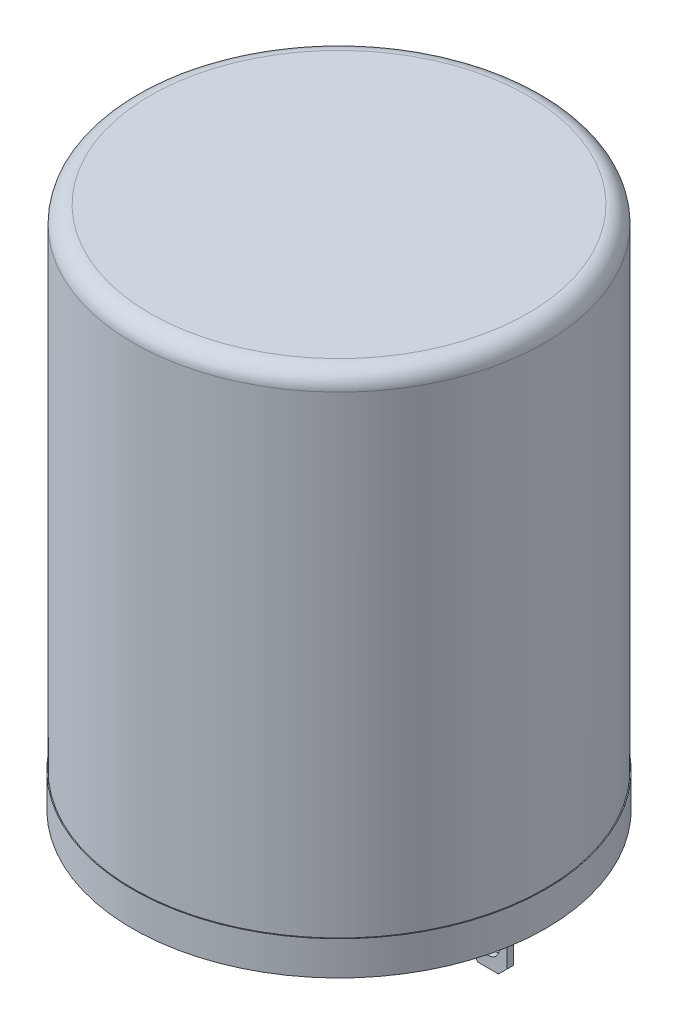
ISO-10303-21;
HEADER;
FILE_DESCRIPTION(('STEP AP214'),'2;1');
FILE_NAME('part.step','',(''),(''),'','','');
FILE_SCHEMA(('AUTOMOTIVE_DESIGN { 1 0 10303 214 1 1 1 1 }'));
ENDSEC;
DATA;
#1=APPLICATION_CONTEXT('core data for automotive mechanical design processes');
#2=APPLICATION_PROTOCOL_DEFINITION('international standard','automotive_design',2000,#1);
#3=PRODUCT_CONTEXT('',#1,'mechanical');
#4=PRODUCT('Part','Part','',(#3));
#5=PRODUCT_RELATED_PRODUCT_CATEGORY('part','',(#4));
#6=PRODUCT_DEFINITION_FORMATION('','',#4);
#7=PRODUCT_DEFINITION_CONTEXT('part definition',#1,'design');
#8=PRODUCT_DEFINITION('design','',#6,#7);
#9=PRODUCT_DEFINITION_SHAPE('','',#8);
#10=(LENGTH_UNIT() NAMED_UNIT(*) SI_UNIT(.MILLI.,.METRE.));
#11=(NAMED_UNIT(*) PLANE_ANGLE_UNIT() SI_UNIT($,.RADIAN.));
#12=(NAMED_UNIT(*) SI_UNIT($,.STERADIAN.) SOLID_ANGLE_UNIT());
#13=UNCERTAINTY_MEASURE_WITH_UNIT(LENGTH_MEASURE(1.E-05),#10,'distance_accuracy_value','');
#14=(GEOMETRIC_REPRESENTATION_CONTEXT(3) GLOBAL_UNCERTAINTY_ASSIGNED_CONTEXT((#13)) GLOBAL_UNIT_ASSIGNED_CONTEXT((#10,
#11,#12)) REPRESENTATION_CONTEXT('',''));
#15=CARTESIAN_POINT('',(0.,0.,0.));
#16=DIRECTION('',(0.,0.,1.));
#17=DIRECTION('',(1.,0.,0.));
#18=AXIS2_PLACEMENT_3D('',#15,#16,#17);
#19=CARTESIAN_POINT('',(0.,-29.8,0.));
#20=DIRECTION('',(0.,1.,0.));
#21=DIRECTION('',(-1.,0.,0.));
#22=AXIS2_PLACEMENT_3D('',#19,#20,#21);
#23=CYLINDRICAL_SURFACE('',#22,12.15);
#24=CARTESIAN_POINT('',(0.,-28.8,0.));
#25=DIRECTION('',(0.,1.,0.));
#26=DIRECTION('',(1.,0.,0.));
#27=AXIS2_PLACEMENT_3D('',#24,#25,#26);
#28=CIRCLE('',#27,12.15);
#29=CARTESIAN_POINT('',(12.15,-28.8,0.));
#30=VERTEX_POINT('',#29);
#31=EDGE_CURVE('E351',#30,#30,#28,.T.);
#32=ORIENTED_EDGE('',*,*,#31,.F.);
#33=DIRECTION('',(0.,-1.,0.));
#34=VECTOR('',#33,1.);
#35=CARTESIAN_POINT('',(12.15,-29.8,0.));
#36=LINE('',#35,#34);
#37=CARTESIAN_POINT('',(12.15,-30.8,0.));
#38=VERTEX_POINT('',#37);
#39=EDGE_CURVE('E11',#30,#38,#36,.T.);
#40=ORIENTED_EDGE('',*,*,#39,.T.);
#41=CARTESIAN_POINT('',(0.,-30.8,0.));
#42=DIRECTION('',(0.,1.,0.));
#43=DIRECTION('',(1.,0.,0.));
#44=AXIS2_PLACEMENT_3D('',#41,#42,#43);
#45=CIRCLE('',#44,12.15);
#46=EDGE_CURVE('E26',#38,#38,#45,.T.);
#47=ORIENTED_EDGE('',*,*,#46,.T.);
#48=ORIENTED_EDGE('',*,*,#39,.F.);
#49=EDGE_LOOP('',(#32,#40,#47,#48));
#50=FACE_BOUND('',#49,.T.);
#51=ADVANCED_FACE('F16',(#50),#23,.T.);
#52=CARTESIAN_POINT('',(-12.15,-30.8,0.));
#53=DIRECTION('',(0.,-1.,0.));
#54=DIRECTION('',(0.,0.,-1.));
#55=AXIS2_PLACEMENT_3D('',#52,#53,#54);
#56=PLANE('',#55);
#57=CARTESIAN_POINT('',(0.,-30.8,0.));
#58=DIRECTION('',(0.,1.,0.));
#59=DIRECTION('',(1.,0.,0.));
#60=AXIS2_PLACEMENT_3D('',#57,#58,#59);
#61=CIRCLE('',#60,11.6);
#62=CARTESIAN_POINT('',(11.6,-30.8,0.));
#63=VERTEX_POINT('',#62);
#64=EDGE_CURVE('E319',#63,#63,#61,.T.);
#65=ORIENTED_EDGE('',*,*,#64,.T.);
#66=EDGE_LOOP('',(#65));
#67=FACE_BOUND('',#66,.T.);
#68=ORIENTED_EDGE('',*,*,#46,.F.);
#69=EDGE_LOOP('',(#68));
#70=FACE_BOUND('',#69,.T.);
#71=ADVANCED_FACE('F453',(#67,#70),#56,.T.);
#72=CARTESIAN_POINT('',(0.,-30.45,0.));
#73=DIRECTION('',(0.,1.,0.));
#74=DIRECTION('',(-1.,0.,0.));
#75=AXIS2_PLACEMENT_3D('',#72,#73,#74);
#76=CYLINDRICAL_SURFACE('',#75,11.6);
#77=CARTESIAN_POINT('',(0.,-30.1,0.));
#78=DIRECTION('',(0.,1.,0.));
#79=DIRECTION('',(1.,0.,0.));
#80=AXIS2_PLACEMENT_3D('',#77,#78,#79);
#81=CIRCLE('',#80,11.6);
#82=CARTESIAN_POINT('',(11.6,-30.1,0.));
#83=VERTEX_POINT('',#82);
#84=EDGE_CURVE('E392',#83,#83,#81,.T.);
#85=ORIENTED_EDGE('',*,*,#84,.T.);
#86=DIRECTION('',(0.,-1.,0.));
#87=VECTOR('',#86,1.);
#88=CARTESIAN_POINT('',(11.6,-30.45,0.));
#89=LINE('',#88,#87);
#90=EDGE_CURVE('E322',#83,#63,#89,.T.);
#91=ORIENTED_EDGE('',*,*,#90,.T.);
#92=ORIENTED_EDGE('',*,*,#64,.F.);
#93=ORIENTED_EDGE('',*,*,#90,.F.);
#94=EDGE_LOOP('',(#85,#91,#92,#93));
#95=FACE_BOUND('',#94,.T.);
#96=ADVANCED_FACE('F449',(#95),#76,.F.);
#97=CARTESIAN_POINT('',(-12.1,-28.8,0.));
#98=DIRECTION('',(0.,1.,0.));
#99=DIRECTION('',(1.,0.,0.));
#100=AXIS2_PLACEMENT_3D('',#97,#98,#99);
#101=PLANE('',#100);
#102=CARTESIAN_POINT('',(0.,-28.8,0.));
#103=DIRECTION('',(0.,1.,0.));
#104=DIRECTION('',(1.,0.,0.));
#105=AXIS2_PLACEMENT_3D('',#102,#103,#104);
#106=CIRCLE('',#105,12.1);
#107=CARTESIAN_POINT('',(12.1,-28.8,0.));
#108=VERTEX_POINT('',#107);
#109=EDGE_CURVE('E307',#108,#108,#106,.T.);
#110=ORIENTED_EDGE('',*,*,#109,.F.);
#111=EDGE_LOOP('',(#110));
#112=FACE_BOUND('',#111,.T.);
#113=ORIENTED_EDGE('',*,*,#31,.T.);
#114=EDGE_LOOP('',(#113));
#115=FACE_BOUND('',#114,.T.);
#116=ADVANCED_FACE('F445',(#112,#115),#101,.T.);
#117=CARTESIAN_POINT('',(-8.975,-32.2,0.2));
#118=DIRECTION('',(0.,0.,1.));
#119=DIRECTION('',(1.,0.,0.));
#120=AXIS2_PLACEMENT_3D('',#117,#118,#119);
#121=PLANE('',#120);
#122=CARTESIAN_POINT('',(-8.975,-33.,0.2));
#123=DIRECTION('',(0.,0.,-1.));
#124=DIRECTION('',(1.,0.,0.));
#125=AXIS2_PLACEMENT_3D('',#122,#123,#124);
#126=CIRCLE('',#125,0.65);
#127=CARTESIAN_POINT('',(-9.625,-33.,0.2));
#128=VERTEX_POINT('',#127);
#129=EDGE_CURVE('E333',#128,#128,#126,.T.);
#130=ORIENTED_EDGE('',*,*,#129,.T.);
#131=EDGE_LOOP('',(#130));
#132=FACE_BOUND('',#131,.T.);
#133=DIRECTION('',(-0.707106781186549,-0.707106781186546,0.));
#134=VECTOR('',#133,1.);
#135=CARTESIAN_POINT('',(-7.875,-33.8,0.2));
#136=LINE('',#135,#134);
#137=CARTESIAN_POINT('',(-7.875,-33.8,0.2));
#138=VERTEX_POINT('',#137);
#139=CARTESIAN_POINT('',(-8.375,-34.3,0.2));
#140=VERTEX_POINT('',#139);
#141=EDGE_CURVE('E238',#138,#140,#136,.T.);
#142=ORIENTED_EDGE('',*,*,#141,.F.);
#143=DIRECTION('',(0.,1.,0.));
#144=VECTOR('',#143,1.);
#145=CARTESIAN_POINT('',(-7.875,-30.1,0.2));
#146=LINE('',#145,#144);
#147=CARTESIAN_POINT('',(-7.875,-30.1,0.2));
#148=VERTEX_POINT('',#147);
#149=EDGE_CURVE('E222',#138,#148,#146,.T.);
#150=ORIENTED_EDGE('',*,*,#149,.T.);
#151=DIRECTION('',(1.,0.,0.));
#152=VECTOR('',#151,1.);
#153=CARTESIAN_POINT('',(-10.2875,-30.1,0.2));
#154=LINE('',#153,#152);
#155=CARTESIAN_POINT('',(-10.075,-30.1,0.2));
#156=VERTEX_POINT('',#155);
#157=EDGE_CURVE('E382',#156,#148,#154,.T.);
#158=ORIENTED_EDGE('',*,*,#157,.F.);
#159=DIRECTION('',(0.,-1.,0.));
#160=VECTOR('',#159,1.);
#161=CARTESIAN_POINT('',(-10.075,-34.3,0.2));
#162=LINE('',#161,#160);
#163=CARTESIAN_POINT('',(-10.075,-33.8,0.2));
#164=VERTEX_POINT('',#163);
#165=EDGE_CURVE('E332',#156,#164,#162,.T.);
#166=ORIENTED_EDGE('',*,*,#165,.T.);
#167=DIRECTION('',(-0.707106781186549,0.707106781186546,0.));
#168=VECTOR('',#167,1.);
#169=CARTESIAN_POINT('',(-10.075,-33.8,0.2));
#170=LINE('',#169,#168);
#171=CARTESIAN_POINT('',(-9.575,-34.3,0.2));
#172=VERTEX_POINT('',#171);
#173=EDGE_CURVE('E342',#172,#164,#170,.T.);
#174=ORIENTED_EDGE('',*,*,#173,.F.);
#175=DIRECTION('',(1.,0.,0.));
#176=VECTOR('',#175,1.);
#177=CARTESIAN_POINT('',(-7.875,-34.3,0.2));
#178=LINE('',#177,#176);
#179=EDGE_CURVE('E343',#172,#140,#178,.T.);
#180=ORIENTED_EDGE('',*,*,#179,.T.);
#181=EDGE_LOOP('',(#142,#150,#158,#166,#174,#180));
#182=FACE_BOUND('',#181,.T.);
#183=ADVANCED_FACE('F448',(#132,#182),#121,.T.);
#184=CARTESIAN_POINT('',(-7.875,-34.3,0.));
#185=DIRECTION('',(1.,0.,0.));
#186=DIRECTION('',(0.,1.,0.));
#187=AXIS2_PLACEMENT_3D('',#184,#185,#186);
#188=PLANE('',#187);
#189=DIRECTION('',(0.,0.,1.));
#190=VECTOR('',#189,1.);
#191=CARTESIAN_POINT('',(-7.875,-33.8,0.));
#192=LINE('',#191,#190);
#193=CARTESIAN_POINT('',(-7.875,-33.8,-0.2));
#194=VERTEX_POINT('',#193);
#195=EDGE_CURVE('E219',#194,#138,#192,.T.);
#196=ORIENTED_EDGE('',*,*,#195,.F.);
#197=DIRECTION('',(0.,-1.,0.));
#198=VECTOR('',#197,1.);
#199=CARTESIAN_POINT('',(-7.875,-30.1,-0.2));
#200=LINE('',#199,#198);
#201=CARTESIAN_POINT('',(-7.875,-30.1,-0.2));
#202=VERTEX_POINT('',#201);
#203=EDGE_CURVE('E190',#202,#194,#200,.T.);
#204=ORIENTED_EDGE('',*,*,#203,.F.);
#205=DIRECTION('',(0.,0.,-1.));
#206=VECTOR('',#205,1.);
#207=CARTESIAN_POINT('',(-7.875,-30.1,0.));
#208=LINE('',#207,#206);
#209=EDGE_CURVE('E356',#148,#202,#208,.T.);
#210=ORIENTED_EDGE('',*,*,#209,.F.);
#211=ORIENTED_EDGE('',*,*,#149,.F.);
#212=EDGE_LOOP('',(#196,#204,#210,#211));
#213=FACE_BOUND('',#212,.T.);
#214=ADVANCED_FACE('F220',(#213),#188,.T.);
#215=CARTESIAN_POINT('',(-10.075,-30.1,0.));
#216=DIRECTION('',(-1.,0.,0.));
#217=DIRECTION('',(0.,0.,1.));
#218=AXIS2_PLACEMENT_3D('',#215,#216,#217);
#219=PLANE('',#218);
#220=DIRECTION('',(0.,0.,-1.));
#221=VECTOR('',#220,1.);
#222=CARTESIAN_POINT('',(-10.075,-33.8,0.));
#223=LINE('',#222,#221);
#224=CARTESIAN_POINT('',(-10.075,-33.8,-0.2));
#225=VERTEX_POINT('',#224);
#226=EDGE_CURVE('E348',#164,#225,#223,.T.);
#227=ORIENTED_EDGE('',*,*,#226,.F.);
#228=ORIENTED_EDGE('',*,*,#165,.F.);
#229=DIRECTION('',(0.,0.,1.));
#230=VECTOR('',#229,1.);
#231=CARTESIAN_POINT('',(-10.075,-30.1,0.));
#232=LINE('',#231,#230);
#233=CARTESIAN_POINT('',(-10.075,-30.1,-0.2));
#234=VERTEX_POINT('',#233);
#235=EDGE_CURVE('E386',#234,#156,#232,.T.);
#236=ORIENTED_EDGE('',*,*,#235,.F.);
#237=DIRECTION('',(0.,1.,0.));
#238=VECTOR('',#237,1.);
#239=CARTESIAN_POINT('',(-10.075,-34.3,-0.2));
#240=LINE('',#239,#238);
#241=EDGE_CURVE('E178',#225,#234,#240,.T.);
#242=ORIENTED_EDGE('',*,*,#241,.F.);
#243=EDGE_LOOP('',(#227,#228,#236,#242));
#244=FACE_BOUND('',#243,.T.);
#245=ADVANCED_FACE('F538',(#244),#219,.T.);
#246=CARTESIAN_POINT('',(-8.975,-33.,0.));
#247=DIRECTION('',(0.,0.,1.));
#248=DIRECTION('',(1.,0.,0.));
#249=AXIS2_PLACEMENT_3D('',#246,#247,#248);
#250=CYLINDRICAL_SURFACE('',#249,0.65);
#251=ORIENTED_EDGE('',*,*,#129,.F.);
#252=DIRECTION('',(0.,0.,-1.));
#253=VECTOR('',#252,1.);
#254=CARTESIAN_POINT('',(-9.625,-33.,0.));
#255=LINE('',#254,#253);
#256=CARTESIAN_POINT('',(-9.625,-33.,-0.2));
#257=VERTEX_POINT('',#256);
#258=EDGE_CURVE('E329',#128,#257,#255,.T.);
#259=ORIENTED_EDGE('',*,*,#258,.T.);
#260=CARTESIAN_POINT('',(-8.975,-33.,-0.2));
#261=DIRECTION('',(0.,0.,1.));
#262=DIRECTION('',(1.,0.,0.));
#263=AXIS2_PLACEMENT_3D('',#260,#261,#262);
#264=CIRCLE('',#263,0.65);
#265=EDGE_CURVE('E215',#257,#257,#264,.T.);
#266=ORIENTED_EDGE('',*,*,#265,.F.);
#267=ORIENTED_EDGE('',*,*,#258,.F.);
#268=EDGE_LOOP('',(#251,#259,#266,#267));
#269=FACE_BOUND('',#268,.T.);
#270=ADVANCED_FACE('F526',(#269),#250,.F.);
#271=CARTESIAN_POINT('',(8.975,-32.2,0.2));
#272=DIRECTION('',(0.,0.,1.));
#273=DIRECTION('',(1.,0.,0.));
#274=AXIS2_PLACEMENT_3D('',#271,#272,#273);
#275=PLANE('',#274);
#276=CARTESIAN_POINT('',(8.975,-33.,0.2));
#277=DIRECTION('',(0.,0.,-1.));
#278=DIRECTION('',(1.,0.,0.));
#279=AXIS2_PLACEMENT_3D('',#276,#277,#278);
#280=CIRCLE('',#279,0.65);
#281=CARTESIAN_POINT('',(8.325,-33.,0.2));
#282=VERTEX_POINT('',#281);
#283=EDGE_CURVE('E273',#282,#282,#280,.T.);
#284=ORIENTED_EDGE('',*,*,#283,.T.);
#285=EDGE_LOOP('',(#284));
#286=FACE_BOUND('',#285,.T.);
#287=DIRECTION('',(-0.707106781186549,0.707106781186546,0.));
#288=VECTOR('',#287,1.);
#289=CARTESIAN_POINT('',(7.875,-33.8,0.2));
#290=LINE('',#289,#288);
#291=CARTESIAN_POINT('',(8.375,-34.3,0.2));
#292=VERTEX_POINT('',#291);
#293=CARTESIAN_POINT('',(7.875,-33.8,0.2));
#294=VERTEX_POINT('',#293);
#295=EDGE_CURVE('E359',#292,#294,#290,.T.);
#296=ORIENTED_EDGE('',*,*,#295,.F.);
#297=DIRECTION('',(1.,0.,0.));
#298=VECTOR('',#297,1.);
#299=CARTESIAN_POINT('',(7.875,-34.3,0.2));
#300=LINE('',#299,#298);
#301=CARTESIAN_POINT('',(9.575,-34.3,0.2));
#302=VERTEX_POINT('',#301);
#303=EDGE_CURVE('E363',#292,#302,#300,.T.);
#304=ORIENTED_EDGE('',*,*,#303,.T.);
#305=DIRECTION('',(-0.707106781186549,-0.707106781186546,0.));
#306=VECTOR('',#305,1.);
#307=CARTESIAN_POINT('',(10.075,-33.8,0.2));
#308=LINE('',#307,#306);
#309=CARTESIAN_POINT('',(10.075,-33.8,0.2));
#310=VERTEX_POINT('',#309);
#311=EDGE_CURVE('E283',#310,#302,#308,.T.);
#312=ORIENTED_EDGE('',*,*,#311,.F.);
#313=DIRECTION('',(0.,1.,0.));
#314=VECTOR('',#313,1.);
#315=CARTESIAN_POINT('',(10.075,-34.3,0.2));
#316=LINE('',#315,#314);
#317=CARTESIAN_POINT('',(10.075,-30.1,0.2));
#318=VERTEX_POINT('',#317);
#319=EDGE_CURVE('E280',#310,#318,#316,.T.);
#320=ORIENTED_EDGE('',*,*,#319,.T.);
#321=DIRECTION('',(1.,0.,0.));
#322=VECTOR('',#321,1.);
#323=CARTESIAN_POINT('',(-1.3125,-30.1,0.2));
#324=LINE('',#323,#322);
#325=CARTESIAN_POINT('',(7.875,-30.1,0.2));
#326=VERTEX_POINT('',#325);
#327=EDGE_CURVE('E279',#326,#318,#324,.T.);
#328=ORIENTED_EDGE('',*,*,#327,.F.);
#329=DIRECTION('',(0.,-1.,0.));
#330=VECTOR('',#329,1.);
#331=CARTESIAN_POINT('',(7.875,-30.1,0.2));
#332=LINE('',#331,#330);
#333=EDGE_CURVE('E272',#326,#294,#332,.T.);
#334=ORIENTED_EDGE('',*,*,#333,.T.);
#335=EDGE_LOOP('',(#296,#304,#312,#320,#328,#334));
#336=FACE_BOUND('',#335,.T.);
#337=ADVANCED_FACE('F521',(#286,#336),#275,.T.);
#338=CARTESIAN_POINT('',(7.875,-30.1,0.));
#339=DIRECTION('',(-1.,0.,0.));
#340=DIRECTION('',(0.,0.,1.));
#341=AXIS2_PLACEMENT_3D('',#338,#339,#340);
#342=PLANE('',#341);
#343=DIRECTION('',(0.,0.,-1.));
#344=VECTOR('',#343,1.);
#345=CARTESIAN_POINT('',(7.875,-33.8,0.));
#346=LINE('',#345,#344);
#347=CARTESIAN_POINT('',(7.875,-33.8,-0.2));
#348=VERTEX_POINT('',#347);
#349=EDGE_CURVE('E315',#294,#348,#346,.T.);
#350=ORIENTED_EDGE('',*,*,#349,.F.);
#351=ORIENTED_EDGE('',*,*,#333,.F.);
#352=DIRECTION('',(0.,0.,1.));
#353=VECTOR('',#352,1.);
#354=CARTESIAN_POINT('',(7.875,-30.1,0.));
#355=LINE('',#354,#353);
#356=CARTESIAN_POINT('',(7.875,-30.1,-0.2));
#357=VERTEX_POINT('',#356);
#358=EDGE_CURVE('E242',#357,#326,#355,.T.);
#359=ORIENTED_EDGE('',*,*,#358,.F.);
#360=DIRECTION('',(0.,1.,0.));
#361=VECTOR('',#360,1.);
#362=CARTESIAN_POINT('',(7.875,-30.1,-0.2));
#363=LINE('',#362,#361);
#364=EDGE_CURVE('E377',#348,#357,#363,.T.);
#365=ORIENTED_EDGE('',*,*,#364,.F.);
#366=EDGE_LOOP('',(#350,#351,#359,#365));
#367=FACE_BOUND('',#366,.T.);
#368=ADVANCED_FACE('F485',(#367),#342,.T.);
#369=CARTESIAN_POINT('',(8.975,-33.,0.));
#370=DIRECTION('',(0.,0.,1.));
#371=DIRECTION('',(1.,0.,0.));
#372=AXIS2_PLACEMENT_3D('',#369,#370,#371);
#373=CYLINDRICAL_SURFACE('',#372,0.65);
#374=ORIENTED_EDGE('',*,*,#283,.F.);
#375=DIRECTION('',(0.,0.,-1.));
#376=VECTOR('',#375,1.);
#377=CARTESIAN_POINT('',(8.325,-33.,0.));
#378=LINE('',#377,#376);
#379=CARTESIAN_POINT('',(8.325,-33.,-0.2));
#380=VERTEX_POINT('',#379);
#381=EDGE_CURVE('E268',#282,#380,#378,.T.);
#382=ORIENTED_EDGE('',*,*,#381,.T.);
#383=CARTESIAN_POINT('',(8.975,-33.,-0.2));
#384=DIRECTION('',(0.,0.,1.));
#385=DIRECTION('',(1.,0.,0.));
#386=AXIS2_PLACEMENT_3D('',#383,#384,#385);
#387=CIRCLE('',#386,0.65);
#388=EDGE_CURVE('E415',#380,#380,#387,.T.);
#389=ORIENTED_EDGE('',*,*,#388,.F.);
#390=ORIENTED_EDGE('',*,*,#381,.F.);
#391=EDGE_LOOP('',(#374,#382,#389,#390));
#392=FACE_BOUND('',#391,.T.);
#393=ADVANCED_FACE('F481',(#392),#373,.F.);
#394=CARTESIAN_POINT('',(10.075,-34.3,0.));
#395=DIRECTION('',(1.,0.,0.));
#396=DIRECTION('',(0.,1.,0.));
#397=AXIS2_PLACEMENT_3D('',#394,#395,#396);
#398=PLANE('',#397);
#399=DIRECTION('',(0.,0.,1.));
#400=VECTOR('',#399,1.);
#401=CARTESIAN_POINT('',(10.075,-33.8,0.));
#402=LINE('',#401,#400);
#403=CARTESIAN_POINT('',(10.075,-33.8,-0.2));
#404=VERTEX_POINT('',#403);
#405=EDGE_CURVE('E414',#404,#310,#402,.T.);
#406=ORIENTED_EDGE('',*,*,#405,.F.);
#407=DIRECTION('',(0.,-1.,0.));
#408=VECTOR('',#407,1.);
#409=CARTESIAN_POINT('',(10.075,-34.3,-0.2));
#410=LINE('',#409,#408);
#411=CARTESIAN_POINT('',(10.075,-30.1,-0.2));
#412=VERTEX_POINT('',#411);
#413=EDGE_CURVE('E393',#412,#404,#410,.T.);
#414=ORIENTED_EDGE('',*,*,#413,.F.);
#415=DIRECTION('',(0.,0.,-1.));
#416=VECTOR('',#415,1.);
#417=CARTESIAN_POINT('',(10.075,-30.1,0.));
#418=LINE('',#417,#416);
#419=EDGE_CURVE('E274',#318,#412,#418,.T.);
#420=ORIENTED_EDGE('',*,*,#419,.F.);
#421=ORIENTED_EDGE('',*,*,#319,.F.);
#422=EDGE_LOOP('',(#406,#414,#420,#421));
#423=FACE_BOUND('',#422,.T.);
#424=ADVANCED_FACE('F484',(#423),#398,.T.);
#425=CARTESIAN_POINT('',(9.825,-34.05,0.));
#426=DIRECTION('',(0.707106781186546,-0.707106781186549,0.));
#427=DIRECTION('',(0.,0.,-1.));
#428=AXIS2_PLACEMENT_3D('',#425,#426,#427);
#429=PLANE('',#428);
#430=DIRECTION('',(0.707106781186549,0.707106781186546,0.));
#431=VECTOR('',#430,1.);
#432=CARTESIAN_POINT('',(10.075,-33.8,-0.2));
#433=LINE('',#432,#431);
#434=CARTESIAN_POINT('',(9.575,-34.3,-0.2));
#435=VERTEX_POINT('',#434);
#436=EDGE_CURVE('E397',#435,#404,#433,.T.);
#437=ORIENTED_EDGE('',*,*,#436,.T.);
#438=ORIENTED_EDGE('',*,*,#405,.T.);
#439=ORIENTED_EDGE('',*,*,#311,.T.);
#440=DIRECTION('',(0.,0.,-1.));
#441=VECTOR('',#440,1.);
#442=CARTESIAN_POINT('',(9.575,-34.3,0.));
#443=LINE('',#442,#441);
#444=EDGE_CURVE('E328',#302,#435,#443,.T.);
#445=ORIENTED_EDGE('',*,*,#444,.T.);
#446=EDGE_LOOP('',(#437,#438,#439,#445));
#447=FACE_BOUND('',#446,.T.);
#448=ADVANCED_FACE('F18',(#447),#429,.T.);
#449=CARTESIAN_POINT('',(8.975,-32.2,-0.2));
#450=DIRECTION('',(0.,0.,1.));
#451=DIRECTION('',(1.,0.,0.));
#452=AXIS2_PLACEMENT_3D('',#449,#450,#451);
#453=PLANE('',#452);
#454=ORIENTED_EDGE('',*,*,#388,.T.);
#455=EDGE_LOOP('',(#454));
#456=FACE_BOUND('',#455,.T.);
#457=DIRECTION('',(0.707106781186549,-0.707106781186546,0.));
#458=VECTOR('',#457,1.);
#459=CARTESIAN_POINT('',(7.875,-33.8,-0.2));
#460=LINE('',#459,#458);
#461=CARTESIAN_POINT('',(8.375,-34.3,-0.2));
#462=VERTEX_POINT('',#461);
#463=EDGE_CURVE('E263',#348,#462,#460,.T.);
#464=ORIENTED_EDGE('',*,*,#463,.F.);
#465=ORIENTED_EDGE('',*,*,#364,.T.);
#466=DIRECTION('',(-1.,0.,0.));
#467=VECTOR('',#466,1.);
#468=CARTESIAN_POINT('',(-1.3125,-30.1,-0.2));
#469=LINE('',#468,#467);
#470=EDGE_CURVE('E352',#412,#357,#469,.T.);
#471=ORIENTED_EDGE('',*,*,#470,.F.);
#472=ORIENTED_EDGE('',*,*,#413,.T.);
#473=ORIENTED_EDGE('',*,*,#436,.F.);
#474=DIRECTION('',(-1.,0.,0.));
#475=VECTOR('',#474,1.);
#476=CARTESIAN_POINT('',(7.875,-34.3,-0.2));
#477=LINE('',#476,#475);
#478=EDGE_CURVE('E262',#435,#462,#477,.T.);
#479=ORIENTED_EDGE('',*,*,#478,.T.);
#480=EDGE_LOOP('',(#464,#465,#471,#472,#473,#479));
#481=FACE_BOUND('',#480,.T.);
#482=ADVANCED_FACE('F467',(#456,#481),#453,.F.);
#483=CARTESIAN_POINT('',(7.875,-34.3,0.));
#484=DIRECTION('',(0.,-1.,0.));
#485=DIRECTION('',(0.,0.,-1.));
#486=AXIS2_PLACEMENT_3D('',#483,#484,#485);
#487=PLANE('',#486);
#488=DIRECTION('',(0.,0.,1.));
#489=VECTOR('',#488,1.);
#490=CARTESIAN_POINT('',(8.375,-34.3,0.));
#491=LINE('',#490,#489);
#492=EDGE_CURVE('E258',#462,#292,#491,.T.);
#493=ORIENTED_EDGE('',*,*,#492,.F.);
#494=ORIENTED_EDGE('',*,*,#478,.F.);
#495=ORIENTED_EDGE('',*,*,#444,.F.);
#496=ORIENTED_EDGE('',*,*,#303,.F.);
#497=EDGE_LOOP('',(#493,#494,#495,#496));
#498=FACE_BOUND('',#497,.T.);
#499=ADVANCED_FACE('F470',(#498),#487,.T.);
#500=CARTESIAN_POINT('',(8.125,-34.05,0.));
#501=DIRECTION('',(-0.707106781186546,-0.707106781186549,0.));
#502=DIRECTION('',(-0.707106781186549,0.707106781186546,0.));
#503=AXIS2_PLACEMENT_3D('',#500,#501,#502);
#504=PLANE('',#503);
#505=ORIENTED_EDGE('',*,*,#295,.T.);
#506=ORIENTED_EDGE('',*,*,#349,.T.);
#507=ORIENTED_EDGE('',*,*,#463,.T.);
#508=ORIENTED_EDGE('',*,*,#492,.T.);
#509=EDGE_LOOP('',(#505,#506,#507,#508));
#510=FACE_BOUND('',#509,.T.);
#511=ADVANCED_FACE('F503',(#510),#504,.T.);
#512=CARTESIAN_POINT('',(-9.825,-34.05,0.));
#513=DIRECTION('',(-0.707106781186546,-0.707106781186549,0.));
#514=DIRECTION('',(-0.707106781186549,0.707106781186546,0.));
#515=AXIS2_PLACEMENT_3D('',#512,#513,#514);
#516=PLANE('',#515);
#517=DIRECTION('',(0.707106781186549,-0.707106781186546,0.));
#518=VECTOR('',#517,1.);
#519=CARTESIAN_POINT('',(-10.075,-33.8,-0.2));
#520=LINE('',#519,#518);
#521=CARTESIAN_POINT('',(-9.575,-34.3,-0.2));
#522=VERTEX_POINT('',#521);
#523=EDGE_CURVE('E325',#225,#522,#520,.T.);
#524=ORIENTED_EDGE('',*,*,#523,.T.);
#525=DIRECTION('',(0.,0.,1.));
#526=VECTOR('',#525,1.);
#527=CARTESIAN_POINT('',(-9.575,-34.3,0.));
#528=LINE('',#527,#526);
#529=EDGE_CURVE('E339',#522,#172,#528,.T.);
#530=ORIENTED_EDGE('',*,*,#529,.T.);
#531=ORIENTED_EDGE('',*,*,#173,.T.);
#532=ORIENTED_EDGE('',*,*,#226,.T.);
#533=EDGE_LOOP('',(#524,#530,#531,#532));
#534=FACE_BOUND('',#533,.T.);
#535=ADVANCED_FACE('F499',(#534),#516,.T.);
#536=CARTESIAN_POINT('',(-10.075,-34.3,0.));
#537=DIRECTION('',(0.,-1.,0.));
#538=DIRECTION('',(0.,0.,-1.));
#539=AXIS2_PLACEMENT_3D('',#536,#537,#538);
#540=PLANE('',#539);
#541=DIRECTION('',(0.,0.,-1.));
#542=VECTOR('',#541,1.);
#543=CARTESIAN_POINT('',(-8.375,-34.3,0.));
#544=LINE('',#543,#542);
#545=CARTESIAN_POINT('',(-8.375,-34.3,-0.2));
#546=VERTEX_POINT('',#545);
#547=EDGE_CURVE('E231',#140,#546,#544,.T.);
#548=ORIENTED_EDGE('',*,*,#547,.F.);
#549=ORIENTED_EDGE('',*,*,#179,.F.);
#550=ORIENTED_EDGE('',*,*,#529,.F.);
#551=DIRECTION('',(-1.,0.,0.));
#552=VECTOR('',#551,1.);
#553=CARTESIAN_POINT('',(-7.875,-34.3,-0.2));
#554=LINE('',#553,#552);
#555=EDGE_CURVE('E227',#546,#522,#554,.T.);
#556=ORIENTED_EDGE('',*,*,#555,.F.);
#557=EDGE_LOOP('',(#548,#549,#550,#556));
#558=FACE_BOUND('',#557,.T.);
#559=ADVANCED_FACE('F502',(#558),#540,.T.);
#560=CARTESIAN_POINT('',(-8.975,-32.2,-0.2));
#561=DIRECTION('',(0.,0.,1.));
#562=DIRECTION('',(1.,0.,0.));
#563=AXIS2_PLACEMENT_3D('',#560,#561,#562);
#564=PLANE('',#563);
#565=ORIENTED_EDGE('',*,*,#265,.T.);
#566=EDGE_LOOP('',(#565));
#567=FACE_BOUND('',#566,.T.);
#568=DIRECTION('',(0.707106781186549,0.707106781186546,0.));
#569=VECTOR('',#568,1.);
#570=CARTESIAN_POINT('',(-7.875,-33.8,-0.2));
#571=LINE('',#570,#569);
#572=EDGE_CURVE('E210',#546,#194,#571,.T.);
#573=ORIENTED_EDGE('',*,*,#572,.F.);
#574=ORIENTED_EDGE('',*,*,#555,.T.);
#575=ORIENTED_EDGE('',*,*,#523,.F.);
#576=ORIENTED_EDGE('',*,*,#241,.T.);
#577=DIRECTION('',(-1.,0.,0.));
#578=VECTOR('',#577,1.);
#579=CARTESIAN_POINT('',(-10.2875,-30.1,-0.2));
#580=LINE('',#579,#578);
#581=EDGE_CURVE('E213',#202,#234,#580,.T.);
#582=ORIENTED_EDGE('',*,*,#581,.F.);
#583=ORIENTED_EDGE('',*,*,#203,.T.);
#584=EDGE_LOOP('',(#573,#574,#575,#576,#582,#583));
#585=FACE_BOUND('',#584,.T.);
#586=ADVANCED_FACE('F207',(#567,#585),#564,.F.);
#587=CARTESIAN_POINT('',(-8.125,-34.05,0.));
#588=DIRECTION('',(0.707106781186546,-0.707106781186549,0.));
#589=DIRECTION('',(0.,0.,-1.));
#590=AXIS2_PLACEMENT_3D('',#587,#588,#589);
#591=PLANE('',#590);
#592=ORIENTED_EDGE('',*,*,#141,.T.);
#593=ORIENTED_EDGE('',*,*,#547,.T.);
#594=ORIENTED_EDGE('',*,*,#572,.T.);
#595=ORIENTED_EDGE('',*,*,#195,.T.);
#596=EDGE_LOOP('',(#592,#593,#594,#595));
#597=FACE_BOUND('',#596,.T.);
#598=ADVANCED_FACE('F229',(#597),#591,.T.);
#599=CARTESIAN_POINT('',(0.,0.,0.));
#600=DIRECTION('',(0.,1.,0.));
#601=DIRECTION('',(1.,0.,0.));
#602=AXIS2_PLACEMENT_3D('',#599,#600,#601);
#603=PLANE('',#602);
#604=CARTESIAN_POINT('',(0.,0.,0.));
#605=DIRECTION('',(0.,-1.,0.));
#606=DIRECTION('',(1.,0.,0.));
#607=AXIS2_PLACEMENT_3D('',#604,#605,#606);
#608=CIRCLE('',#607,11.1);
#609=CARTESIAN_POINT('',(0.,0.,-11.1));
#610=VERTEX_POINT('',#609);
#611=EDGE_CURVE('E297',#610,#610,#608,.T.);
#612=ORIENTED_EDGE('',*,*,#611,.F.);
#613=EDGE_LOOP('',(#612));
#614=FACE_BOUND('',#613,.T.);
#615=ADVANCED_FACE('F498',(#614),#603,.T.);
#616=CARTESIAN_POINT('',(0.,-14.4,0.));
#617=DIRECTION('',(0.,1.,0.));
#618=DIRECTION('',(-1.,0.,0.));
#619=AXIS2_PLACEMENT_3D('',#616,#617,#618);
#620=CYLINDRICAL_SURFACE('',#619,12.1);
#621=CARTESIAN_POINT('',(0.,-1.,0.));
#622=DIRECTION('',(0.,1.,0.));
#623=DIRECTION('',(1.,0.,0.));
#624=AXIS2_PLACEMENT_3D('',#621,#622,#623);
#625=CIRCLE('',#624,12.1);
#626=CARTESIAN_POINT('',(0.,-1.,-12.1));
#627=VERTEX_POINT('',#626);
#628=CARTESIAN_POINT('',(12.1,-1.,0.));
#629=VERTEX_POINT('',#628);
#630=EDGE_CURVE('E257',#627,#629,#625,.T.);
#631=ORIENTED_EDGE('',*,*,#630,.F.);
#632=CARTESIAN_POINT('',(0.,-1.,0.));
#633=DIRECTION('',(0.,1.,0.));
#634=DIRECTION('',(1.,0.,0.));
#635=AXIS2_PLACEMENT_3D('',#632,#633,#634);
#636=CIRCLE('',#635,12.1);
#637=EDGE_CURVE('E253',#629,#627,#636,.T.);
#638=ORIENTED_EDGE('',*,*,#637,.F.);
#639=DIRECTION('',(0.,-1.,0.));
#640=VECTOR('',#639,1.);
#641=CARTESIAN_POINT('',(12.1,-14.4,0.));
#642=LINE('',#641,#640);
#643=EDGE_CURVE('E256',#629,#108,#642,.T.);
#644=ORIENTED_EDGE('',*,*,#643,.T.);
#645=ORIENTED_EDGE('',*,*,#109,.T.);
#646=ORIENTED_EDGE('',*,*,#643,.F.);
#647=EDGE_LOOP('',(#631,#638,#644,#645,#646));
#648=FACE_BOUND('',#647,.T.);
#649=ADVANCED_FACE('F442',(#648),#620,.T.);
#650=CARTESIAN_POINT('',(0.,-1.,0.));
#651=DIRECTION('',(0.,1.,0.));
#652=DIRECTION('',(0.,0.,1.));
#653=AXIS2_PLACEMENT_3D('',#650,#651,#652);
#654=TOROIDAL_SURFACE('',#653,11.1,1.);
#655=ORIENTED_EDGE('',*,*,#611,.T.);
#656=CARTESIAN_POINT('',(0.,-1.,-11.1));
#657=DIRECTION('',(-1.,0.,0.));
#658=DIRECTION('',(0.,0.,-1.));
#659=AXIS2_PLACEMENT_3D('',#656,#657,#658);
#660=CIRCLE('',#659,1.);
#661=EDGE_CURVE('E290',#610,#627,#660,.T.);
#662=ORIENTED_EDGE('',*,*,#661,.T.);
#663=ORIENTED_EDGE('',*,*,#630,.T.);
#664=ORIENTED_EDGE('',*,*,#637,.T.);
#665=ORIENTED_EDGE('',*,*,#661,.F.);
#666=EDGE_LOOP('',(#655,#662,#663,#664,#665));
#667=FACE_BOUND('',#666,.T.);
#668=ADVANCED_FACE('F479',(#667),#654,.T.);
#669=CARTESIAN_POINT('',(-3.25,-32.4,0.));
#670=DIRECTION('',(0.,-1.,0.));
#671=DIRECTION('',(0.,0.,-1.));
#672=AXIS2_PLACEMENT_3D('',#669,#670,#671);
#673=PLANE('',#672);
#674=CARTESIAN_POINT('',(0.,-32.4,0.));
#675=DIRECTION('',(0.,1.,0.));
#676=DIRECTION('',(1.,0.,0.));
#677=AXIS2_PLACEMENT_3D('',#674,#675,#676);
#678=CIRCLE('',#677,2.25);
#679=CARTESIAN_POINT('',(0.,-32.4,-2.25));
#680=VERTEX_POINT('',#679);
#681=EDGE_CURVE('E303',#680,#680,#678,.T.);
#682=ORIENTED_EDGE('',*,*,#681,.F.);
#683=EDGE_LOOP('',(#682));
#684=FACE_BOUND('',#683,.T.);
#685=ADVANCED_FACE('F475',(#684),#673,.T.);
#686=CARTESIAN_POINT('',(0.,-31.4,0.));
#687=DIRECTION('',(0.,1.,0.));
#688=DIRECTION('',(0.,0.,1.));
#689=AXIS2_PLACEMENT_3D('',#686,#687,#688);
#690=TOROIDAL_SURFACE('',#689,2.25,1.);
#691=CARTESIAN_POINT('',(0.,-31.4,0.));
#692=DIRECTION('',(0.,-1.,0.));
#693=DIRECTION('',(1.,0.,0.));
#694=AXIS2_PLACEMENT_3D('',#691,#692,#693);
#695=CIRCLE('',#694,3.25);
#696=CARTESIAN_POINT('',(3.25,-31.4,0.));
#697=VERTEX_POINT('',#696);
#698=CARTESIAN_POINT('',(0.,-31.4,-3.25));
#699=VERTEX_POINT('',#698);
#700=EDGE_CURVE('E287',#697,#699,#695,.T.);
#701=ORIENTED_EDGE('',*,*,#700,.T.);
#702=CARTESIAN_POINT('',(0.,-31.4,-2.25));
#703=DIRECTION('',(-1.,0.,0.));
#704=DIRECTION('',(0.,0.,-1.));
#705=AXIS2_PLACEMENT_3D('',#702,#703,#704);
#706=CIRCLE('',#705,1.);
#707=EDGE_CURVE('E278',#699,#680,#706,.T.);
#708=ORIENTED_EDGE('',*,*,#707,.T.);
#709=ORIENTED_EDGE('',*,*,#681,.T.);
#710=ORIENTED_EDGE('',*,*,#707,.F.);
#711=CARTESIAN_POINT('',(0.,-31.4,0.));
#712=DIRECTION('',(0.,-1.,0.));
#713=DIRECTION('',(1.,0.,0.));
#714=AXIS2_PLACEMENT_3D('',#711,#712,#713);
#715=CIRCLE('',#714,3.25);
#716=EDGE_CURVE('E284',#699,#697,#715,.T.);
#717=ORIENTED_EDGE('',*,*,#716,.T.);
#718=EDGE_LOOP('',(#701,#708,#709,#710,#717));
#719=FACE_BOUND('',#718,.T.);
#720=ADVANCED_FACE('F478',(#719),#690,.T.);
#721=CARTESIAN_POINT('',(-11.6,-30.1,0.));
#722=DIRECTION('',(0.,-1.,0.));
#723=DIRECTION('',(0.,0.,-1.));
#724=AXIS2_PLACEMENT_3D('',#721,#722,#723);
#725=PLANE('',#724);
#726=CARTESIAN_POINT('',(0.,-30.1,0.));
#727=DIRECTION('',(0.,-1.,0.));
#728=DIRECTION('',(1.,0.,0.));
#729=AXIS2_PLACEMENT_3D('',#726,#727,#728);
#730=CIRCLE('',#729,3.75);
#731=CARTESIAN_POINT('',(0.,-30.1,-3.75));
#732=VERTEX_POINT('',#731);
#733=EDGE_CURVE('E264',#732,#732,#730,.T.);
#734=ORIENTED_EDGE('',*,*,#733,.F.);
#735=EDGE_LOOP('',(#734));
#736=FACE_BOUND('',#735,.T.);
#737=ORIENTED_EDGE('',*,*,#470,.T.);
#738=ORIENTED_EDGE('',*,*,#358,.T.);
#739=ORIENTED_EDGE('',*,*,#327,.T.);
#740=ORIENTED_EDGE('',*,*,#419,.T.);
#741=EDGE_LOOP('',(#737,#738,#739,#740));
#742=FACE_BOUND('',#741,.T.);
#743=ORIENTED_EDGE('',*,*,#581,.T.);
#744=ORIENTED_EDGE('',*,*,#235,.T.);
#745=ORIENTED_EDGE('',*,*,#157,.T.);
#746=ORIENTED_EDGE('',*,*,#209,.T.);
#747=EDGE_LOOP('',(#743,#744,#745,#746));
#748=FACE_BOUND('',#747,.T.);
#749=ORIENTED_EDGE('',*,*,#84,.F.);
#750=EDGE_LOOP('',(#749));
#751=FACE_BOUND('',#750,.T.);
#752=ADVANCED_FACE('F491',(#736,#742,#748,#751),#725,.T.);
#753=CARTESIAN_POINT('',(0.,-31.25,0.));
#754=DIRECTION('',(0.,1.,0.));
#755=DIRECTION('',(-1.,0.,0.));
#756=AXIS2_PLACEMENT_3D('',#753,#754,#755);
#757=CYLINDRICAL_SURFACE('',#756,3.25);
#758=CARTESIAN_POINT('',(0.,-30.6,0.));
#759=DIRECTION('',(0.,1.,0.));
#760=DIRECTION('',(1.,0.,0.));
#761=AXIS2_PLACEMENT_3D('',#758,#759,#760);
#762=CIRCLE('',#761,3.25);
#763=CARTESIAN_POINT('',(0.,-30.6,-3.25));
#764=VERTEX_POINT('',#763);
#765=CARTESIAN_POINT('',(3.25,-30.6,0.));
#766=VERTEX_POINT('',#765);
#767=EDGE_CURVE('E244',#764,#766,#762,.T.);
#768=ORIENTED_EDGE('',*,*,#767,.F.);
#769=CARTESIAN_POINT('',(0.,-30.6,0.));
#770=DIRECTION('',(0.,1.,0.));
#771=DIRECTION('',(1.,0.,0.));
#772=AXIS2_PLACEMENT_3D('',#769,#770,#771);
#773=CIRCLE('',#772,3.25);
#774=EDGE_CURVE('E248',#766,#764,#773,.T.);
#775=ORIENTED_EDGE('',*,*,#774,.F.);
#776=DIRECTION('',(0.,-1.,0.));
#777=VECTOR('',#776,1.);
#778=CARTESIAN_POINT('',(3.25,-31.25,0.));
#779=LINE('',#778,#777);
#780=EDGE_CURVE('E267',#766,#697,#779,.T.);
#781=ORIENTED_EDGE('',*,*,#780,.T.);
#782=ORIENTED_EDGE('',*,*,#716,.F.);
#783=ORIENTED_EDGE('',*,*,#700,.F.);
#784=ORIENTED_EDGE('',*,*,#780,.F.);
#785=EDGE_LOOP('',(#768,#775,#781,#782,#783,#784));
#786=FACE_BOUND('',#785,.T.);
#787=ADVANCED_FACE('F487',(#786),#757,.T.);
#788=CARTESIAN_POINT('',(0.,-30.6,0.));
#789=DIRECTION('',(0.,1.,0.));
#790=DIRECTION('',(0.,0.,1.));
#791=AXIS2_PLACEMENT_3D('',#788,#789,#790);
#792=TOROIDAL_SURFACE('',#791,3.75,0.5);
#793=ORIENTED_EDGE('',*,*,#767,.T.);
#794=ORIENTED_EDGE('',*,*,#774,.T.);
#795=CARTESIAN_POINT('',(0.,-30.6,-3.75));
#796=DIRECTION('',(-1.,0.,0.));
#797=DIRECTION('',(0.,0.,-1.));
#798=AXIS2_PLACEMENT_3D('',#795,#796,#797);
#799=CIRCLE('',#798,0.5);
#800=EDGE_CURVE('E252',#764,#732,#799,.T.);
#801=ORIENTED_EDGE('',*,*,#800,.T.);
#802=ORIENTED_EDGE('',*,*,#733,.T.);
#803=ORIENTED_EDGE('',*,*,#800,.F.);
#804=EDGE_LOOP('',(#793,#794,#801,#802,#803));
#805=FACE_BOUND('',#804,.T.);
#806=ADVANCED_FACE('F490',(#805),#792,.F.);
#807=CLOSED_SHELL('',(#51,#71,#96,#116,#183,#214,#245,#270,#337,#368,#393,#424,#448,#482,#499,
#511,#535,#559,#586,#598,#615,#649,#668,#685,#720,#752,#787,#806));
#808=MANIFOLD_SOLID_BREP('B1',#807);
#809=ADVANCED_BREP_SHAPE_REPRESENTATION('',(#18,#808),#14);
#810=SHAPE_DEFINITION_REPRESENTATION(#9,#809);
ENDSEC;
END-ISO-10303-21;
